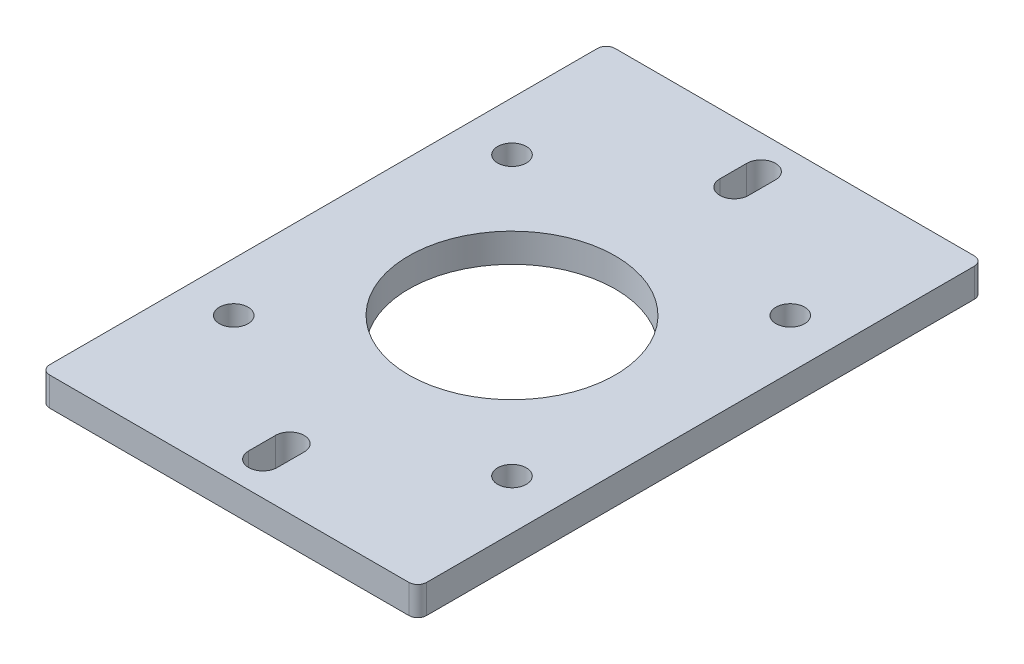
ISO-10303-21;
HEADER;
FILE_DESCRIPTION(('STEP AP214'),'2;1');
FILE_NAME('part.step','',(''),(''),'','','');
FILE_SCHEMA(('AUTOMOTIVE_DESIGN { 1 0 10303 214 1 1 1 1 }'));
ENDSEC;
DATA;
#1=APPLICATION_CONTEXT('core data for automotive mechanical design processes');
#2=APPLICATION_PROTOCOL_DEFINITION('international standard','automotive_design',2000,#1);
#3=PRODUCT_CONTEXT('',#1,'mechanical');
#4=PRODUCT('Part','Part','',(#3));
#5=PRODUCT_RELATED_PRODUCT_CATEGORY('part','',(#4));
#6=PRODUCT_DEFINITION_FORMATION('','',#4);
#7=PRODUCT_DEFINITION_CONTEXT('part definition',#1,'design');
#8=PRODUCT_DEFINITION('design','',#6,#7);
#9=PRODUCT_DEFINITION_SHAPE('','',#8);
#10=(LENGTH_UNIT() NAMED_UNIT(*) SI_UNIT(.MILLI.,.METRE.));
#11=(NAMED_UNIT(*) PLANE_ANGLE_UNIT() SI_UNIT($,.RADIAN.));
#12=(NAMED_UNIT(*) SI_UNIT($,.STERADIAN.) SOLID_ANGLE_UNIT());
#13=UNCERTAINTY_MEASURE_WITH_UNIT(LENGTH_MEASURE(1.E-05),#10,'distance_accuracy_value','');
#14=(GEOMETRIC_REPRESENTATION_CONTEXT(3) GLOBAL_UNCERTAINTY_ASSIGNED_CONTEXT((#13)) GLOBAL_UNIT_ASSIGNED_CONTEXT((#10,
#11,#12)) REPRESENTATION_CONTEXT('',''));
#15=CARTESIAN_POINT('',(0.,0.,0.));
#16=DIRECTION('',(0.,0.,1.));
#17=DIRECTION('',(1.,0.,0.));
#18=AXIS2_PLACEMENT_3D('',#15,#16,#17);
#19=CARTESIAN_POINT('',(0.,3.2,0.));
#20=DIRECTION('',(0.,1.,0.));
#21=DIRECTION('',(0.,0.,1.));
#22=AXIS2_PLACEMENT_3D('',#19,#20,#21);
#23=PLANE('',#22);
#24=DIRECTION('',(0.,0.,-1.));
#25=VECTOR('',#24,1.);
#26=CARTESIAN_POINT('',(1.60000000000005,3.2,-24.75));
#27=LINE('',#26,#25);
#28=CARTESIAN_POINT('',(1.59999999999998,3.2,-24.75));
#29=VERTEX_POINT('',#28);
#30=CARTESIAN_POINT('',(1.60000000000005,3.2,-27.75));
#31=VERTEX_POINT('',#30);
#32=EDGE_CURVE('E397',#29,#31,#27,.T.);
#33=ORIENTED_EDGE('',*,*,#32,.F.);
#34=CARTESIAN_POINT('',(0.,3.2,-24.75));
#35=DIRECTION('',(0.,1.,0.));
#36=DIRECTION('',(0.,0.,1.));
#37=AXIS2_PLACEMENT_3D('',#34,#35,#36);
#38=CIRCLE('',#37,1.59999999999999);
#39=CARTESIAN_POINT('',(-1.60000000000005,3.2,-24.75));
#40=VERTEX_POINT('',#39);
#41=EDGE_CURVE('E395',#40,#29,#38,.T.);
#42=ORIENTED_EDGE('',*,*,#41,.F.);
#43=DIRECTION('',(0.,0.,-1.));
#44=VECTOR('',#43,1.);
#45=CARTESIAN_POINT('',(-1.6,3.2,-24.75));
#46=LINE('',#45,#44);
#47=CARTESIAN_POINT('',(-1.6,3.2,-27.75));
#48=VERTEX_POINT('',#47);
#49=EDGE_CURVE('E377',#40,#48,#46,.T.);
#50=ORIENTED_EDGE('',*,*,#49,.T.);
#51=CARTESIAN_POINT('',(0.,3.2,-27.75));
#52=DIRECTION('',(0.,1.,0.));
#53=DIRECTION('',(0.,0.,1.));
#54=AXIS2_PLACEMENT_3D('',#51,#52,#53);
#55=CIRCLE('',#54,1.59999999999999);
#56=EDGE_CURVE('E384',#31,#48,#55,.T.);
#57=ORIENTED_EDGE('',*,*,#56,.F.);
#58=EDGE_LOOP('',(#33,#42,#50,#57));
#59=FACE_BOUND('',#58,.T.);
#60=DIRECTION('',(0.,0.,-1.));
#61=VECTOR('',#60,1.);
#62=CARTESIAN_POINT('',(1.60000000000005,3.2,27.75));
#63=LINE('',#62,#61);
#64=CARTESIAN_POINT('',(1.59999999999999,3.2,27.75));
#65=VERTEX_POINT('',#64);
#66=CARTESIAN_POINT('',(1.60000000000005,3.2,24.75));
#67=VERTEX_POINT('',#66);
#68=EDGE_CURVE('E383',#65,#67,#63,.T.);
#69=ORIENTED_EDGE('',*,*,#68,.F.);
#70=CARTESIAN_POINT('',(0.,3.2,27.75));
#71=DIRECTION('',(0.,1.,0.));
#72=DIRECTION('',(0.,0.,1.));
#73=AXIS2_PLACEMENT_3D('',#70,#71,#72);
#74=CIRCLE('',#73,1.59999999999999);
#75=CARTESIAN_POINT('',(-1.60000000000005,3.2,27.75));
#76=VERTEX_POINT('',#75);
#77=EDGE_CURVE('E414',#76,#65,#74,.T.);
#78=ORIENTED_EDGE('',*,*,#77,.F.);
#79=DIRECTION('',(0.,0.,-1.));
#80=VECTOR('',#79,1.);
#81=CARTESIAN_POINT('',(-1.59999999999999,3.2,27.75));
#82=LINE('',#81,#80);
#83=CARTESIAN_POINT('',(-1.59999999999999,3.2,24.75));
#84=VERTEX_POINT('',#83);
#85=EDGE_CURVE('E408',#76,#84,#82,.T.);
#86=ORIENTED_EDGE('',*,*,#85,.T.);
#87=CARTESIAN_POINT('',(0.,3.2,24.75));
#88=DIRECTION('',(0.,1.,0.));
#89=DIRECTION('',(0.,0.,1.));
#90=AXIS2_PLACEMENT_3D('',#87,#88,#89);
#91=CIRCLE('',#90,1.59999999999999);
#92=EDGE_CURVE('E421',#67,#84,#91,.T.);
#93=ORIENTED_EDGE('',*,*,#92,.F.);
#94=EDGE_LOOP('',(#69,#78,#86,#93));
#95=FACE_BOUND('',#94,.T.);
#96=CARTESIAN_POINT('',(-15.5,3.2,-15.5));
#97=DIRECTION('',(0.,1.,0.));
#98=DIRECTION('',(0.,0.,1.));
#99=AXIS2_PLACEMENT_3D('',#96,#97,#98);
#100=CIRCLE('',#99,1.6);
#101=CARTESIAN_POINT('',(-15.5,3.2,-13.9));
#102=VERTEX_POINT('',#101);
#103=EDGE_CURVE('E426',#102,#102,#100,.T.);
#104=ORIENTED_EDGE('',*,*,#103,.F.);
#105=EDGE_LOOP('',(#104));
#106=FACE_BOUND('',#105,.T.);
#107=CARTESIAN_POINT('',(15.5,3.2,-15.5));
#108=DIRECTION('',(0.,1.,0.));
#109=DIRECTION('',(0.,0.,1.));
#110=AXIS2_PLACEMENT_3D('',#107,#108,#109);
#111=CIRCLE('',#110,1.6);
#112=CARTESIAN_POINT('',(15.5,3.2,-13.9));
#113=VERTEX_POINT('',#112);
#114=EDGE_CURVE('E432',#113,#113,#111,.T.);
#115=ORIENTED_EDGE('',*,*,#114,.F.);
#116=EDGE_LOOP('',(#115));
#117=FACE_BOUND('',#116,.T.);
#118=CARTESIAN_POINT('',(15.5,3.2,15.5));
#119=DIRECTION('',(0.,1.,0.));
#120=DIRECTION('',(0.,0.,1.));
#121=AXIS2_PLACEMENT_3D('',#118,#119,#120);
#122=CIRCLE('',#121,1.6);
#123=CARTESIAN_POINT('',(15.5,3.2,17.1));
#124=VERTEX_POINT('',#123);
#125=EDGE_CURVE('E438',#124,#124,#122,.T.);
#126=ORIENTED_EDGE('',*,*,#125,.F.);
#127=EDGE_LOOP('',(#126));
#128=FACE_BOUND('',#127,.T.);
#129=CARTESIAN_POINT('',(-15.5,3.2,15.5));
#130=DIRECTION('',(0.,1.,0.));
#131=DIRECTION('',(0.,0.,1.));
#132=AXIS2_PLACEMENT_3D('',#129,#130,#131);
#133=CIRCLE('',#132,1.6);
#134=CARTESIAN_POINT('',(-15.5,3.2,17.1));
#135=VERTEX_POINT('',#134);
#136=EDGE_CURVE('E444',#135,#135,#133,.T.);
#137=ORIENTED_EDGE('',*,*,#136,.F.);
#138=EDGE_LOOP('',(#137));
#139=FACE_BOUND('',#138,.T.);
#140=DIRECTION('',(0.,0.,-1.));
#141=VECTOR('',#140,1.);
#142=CARTESIAN_POINT('',(21.,3.2,31.5));
#143=LINE('',#142,#141);
#144=CARTESIAN_POINT('',(21.,3.2,30.5));
#145=VERTEX_POINT('',#144);
#146=CARTESIAN_POINT('',(21.,3.2,-30.5));
#147=VERTEX_POINT('',#146);
#148=EDGE_CURVE('E462',#145,#147,#143,.T.);
#149=ORIENTED_EDGE('',*,*,#148,.T.);
#150=CARTESIAN_POINT('',(20.,3.2,-30.5));
#151=DIRECTION('',(0.,1.,0.));
#152=DIRECTION('',(0.,0.,1.));
#153=AXIS2_PLACEMENT_3D('',#150,#151,#152);
#154=CIRCLE('',#153,1.);
#155=CARTESIAN_POINT('',(20.,3.2,-31.5));
#156=VERTEX_POINT('',#155);
#157=EDGE_CURVE('E521',#147,#156,#154,.T.);
#158=ORIENTED_EDGE('',*,*,#157,.T.);
#159=DIRECTION('',(-1.,0.,0.));
#160=VECTOR('',#159,1.);
#161=CARTESIAN_POINT('',(21.,3.2,-31.5));
#162=LINE('',#161,#160);
#163=CARTESIAN_POINT('',(-20.,3.2,-31.5));
#164=VERTEX_POINT('',#163);
#165=EDGE_CURVE('E465',#156,#164,#162,.T.);
#166=ORIENTED_EDGE('',*,*,#165,.T.);
#167=CARTESIAN_POINT('',(-20.,3.2,-30.5));
#168=DIRECTION('',(0.,1.,0.));
#169=DIRECTION('',(0.,0.,1.));
#170=AXIS2_PLACEMENT_3D('',#167,#168,#169);
#171=CIRCLE('',#170,1.);
#172=CARTESIAN_POINT('',(-21.,3.2,-30.5));
#173=VERTEX_POINT('',#172);
#174=EDGE_CURVE('E516',#164,#173,#171,.T.);
#175=ORIENTED_EDGE('',*,*,#174,.T.);
#176=DIRECTION('',(0.,0.,1.));
#177=VECTOR('',#176,1.);
#178=CARTESIAN_POINT('',(-21.,3.2,31.5));
#179=LINE('',#178,#177);
#180=CARTESIAN_POINT('',(-21.,3.2,30.5));
#181=VERTEX_POINT('',#180);
#182=EDGE_CURVE('E457',#173,#181,#179,.T.);
#183=ORIENTED_EDGE('',*,*,#182,.T.);
#184=CARTESIAN_POINT('',(-20.,3.2,30.5));
#185=DIRECTION('',(0.,1.,0.));
#186=DIRECTION('',(0.,0.,1.));
#187=AXIS2_PLACEMENT_3D('',#184,#185,#186);
#188=CIRCLE('',#187,1.);
#189=CARTESIAN_POINT('',(-20.,3.2,31.5));
#190=VERTEX_POINT('',#189);
#191=EDGE_CURVE('E281',#181,#190,#188,.T.);
#192=ORIENTED_EDGE('',*,*,#191,.T.);
#193=DIRECTION('',(1.,0.,0.));
#194=VECTOR('',#193,1.);
#195=CARTESIAN_POINT('',(21.,3.2,31.5));
#196=LINE('',#195,#194);
#197=CARTESIAN_POINT('',(20.,3.2,31.5));
#198=VERTEX_POINT('',#197);
#199=EDGE_CURVE('E459',#190,#198,#196,.T.);
#200=ORIENTED_EDGE('',*,*,#199,.T.);
#201=CARTESIAN_POINT('',(20.,3.2,30.5));
#202=DIRECTION('',(0.,1.,0.));
#203=DIRECTION('',(0.,0.,1.));
#204=AXIS2_PLACEMENT_3D('',#201,#202,#203);
#205=CIRCLE('',#204,1.);
#206=EDGE_CURVE('E519',#198,#145,#205,.T.);
#207=ORIENTED_EDGE('',*,*,#206,.T.);
#208=EDGE_LOOP('',(#149,#158,#166,#175,#183,#192,#200,#207));
#209=FACE_BOUND('',#208,.T.);
#210=CARTESIAN_POINT('',(0.,3.2,0.));
#211=DIRECTION('',(0.,1.,0.));
#212=DIRECTION('',(0.,0.,1.));
#213=AXIS2_PLACEMENT_3D('',#210,#211,#212);
#214=CIRCLE('',#213,11.5);
#215=CARTESIAN_POINT('',(0.,3.2,11.5));
#216=VERTEX_POINT('',#215);
#217=EDGE_CURVE('E451',#216,#216,#214,.T.);
#218=ORIENTED_EDGE('',*,*,#217,.F.);
#219=EDGE_LOOP('',(#218));
#220=FACE_BOUND('',#219,.T.);
#221=ADVANCED_FACE('F259',(#59,#95,#106,#117,#128,#139,#209,#220),#23,.T.);
#222=CARTESIAN_POINT('',(0.,0.,0.));
#223=DIRECTION('',(0.,1.,0.));
#224=DIRECTION('',(0.,0.,1.));
#225=AXIS2_PLACEMENT_3D('',#222,#223,#224);
#226=PLANE('',#225);
#227=CARTESIAN_POINT('',(0.,0.,-27.75));
#228=DIRECTION('',(0.,1.,0.));
#229=DIRECTION('',(0.,0.,1.));
#230=AXIS2_PLACEMENT_3D('',#227,#228,#229);
#231=CIRCLE('',#230,1.59999999999999);
#232=CARTESIAN_POINT('',(1.59999999999999,0.,-27.75));
#233=VERTEX_POINT('',#232);
#234=CARTESIAN_POINT('',(-1.6,0.,-27.75));
#235=VERTEX_POINT('',#234);
#236=EDGE_CURVE('E495',#233,#235,#231,.T.);
#237=ORIENTED_EDGE('',*,*,#236,.T.);
#238=DIRECTION('',(0.,0.,1.));
#239=VECTOR('',#238,1.);
#240=CARTESIAN_POINT('',(-1.6,0.,0.));
#241=LINE('',#240,#239);
#242=CARTESIAN_POINT('',(-1.6,0.,-24.75));
#243=VERTEX_POINT('',#242);
#244=EDGE_CURVE('E380',#235,#243,#241,.T.);
#245=ORIENTED_EDGE('',*,*,#244,.T.);
#246=CARTESIAN_POINT('',(0.,0.,-24.75));
#247=DIRECTION('',(0.,1.,0.));
#248=DIRECTION('',(0.,0.,1.));
#249=AXIS2_PLACEMENT_3D('',#246,#247,#248);
#250=CIRCLE('',#249,1.59999999999999);
#251=CARTESIAN_POINT('',(1.59999999999999,0.,-24.75));
#252=VERTEX_POINT('',#251);
#253=EDGE_CURVE('E492',#243,#252,#250,.T.);
#254=ORIENTED_EDGE('',*,*,#253,.T.);
#255=DIRECTION('',(0.,0.,-1.));
#256=VECTOR('',#255,1.);
#257=CARTESIAN_POINT('',(1.59999999999999,0.,0.));
#258=LINE('',#257,#256);
#259=EDGE_CURVE('E489',#252,#233,#258,.T.);
#260=ORIENTED_EDGE('',*,*,#259,.T.);
#261=EDGE_LOOP('',(#237,#245,#254,#260));
#262=FACE_BOUND('',#261,.T.);
#263=CARTESIAN_POINT('',(0.,0.,24.75));
#264=DIRECTION('',(0.,1.,0.));
#265=DIRECTION('',(0.,0.,1.));
#266=AXIS2_PLACEMENT_3D('',#263,#264,#265);
#267=CIRCLE('',#266,1.59999999999999);
#268=CARTESIAN_POINT('',(1.6,0.,24.75));
#269=VERTEX_POINT('',#268);
#270=CARTESIAN_POINT('',(-1.59999999999999,0.,24.75));
#271=VERTEX_POINT('',#270);
#272=EDGE_CURVE('E483',#269,#271,#267,.T.);
#273=ORIENTED_EDGE('',*,*,#272,.T.);
#274=DIRECTION('',(0.,0.,1.));
#275=VECTOR('',#274,1.);
#276=CARTESIAN_POINT('',(-1.6,0.,0.));
#277=LINE('',#276,#275);
#278=CARTESIAN_POINT('',(-1.59999999999999,0.,27.75));
#279=VERTEX_POINT('',#278);
#280=EDGE_CURVE('E486',#271,#279,#277,.T.);
#281=ORIENTED_EDGE('',*,*,#280,.T.);
#282=CARTESIAN_POINT('',(0.,0.,27.75));
#283=DIRECTION('',(0.,1.,0.));
#284=DIRECTION('',(0.,0.,1.));
#285=AXIS2_PLACEMENT_3D('',#282,#283,#284);
#286=CIRCLE('',#285,1.59999999999999);
#287=CARTESIAN_POINT('',(1.6,0.,27.75));
#288=VERTEX_POINT('',#287);
#289=EDGE_CURVE('E480',#279,#288,#286,.T.);
#290=ORIENTED_EDGE('',*,*,#289,.T.);
#291=DIRECTION('',(0.,0.,-1.));
#292=VECTOR('',#291,1.);
#293=CARTESIAN_POINT('',(1.59999999999999,0.,0.));
#294=LINE('',#293,#292);
#295=EDGE_CURVE('E468',#288,#269,#294,.T.);
#296=ORIENTED_EDGE('',*,*,#295,.T.);
#297=EDGE_LOOP('',(#273,#281,#290,#296));
#298=FACE_BOUND('',#297,.T.);
#299=CARTESIAN_POINT('',(-15.5,0.,-15.5));
#300=DIRECTION('',(0.,1.,0.));
#301=DIRECTION('',(0.,0.,1.));
#302=AXIS2_PLACEMENT_3D('',#299,#300,#301);
#303=CIRCLE('',#302,1.6);
#304=CARTESIAN_POINT('',(-15.5,0.,-13.9));
#305=VERTEX_POINT('',#304);
#306=EDGE_CURVE('E429',#305,#305,#303,.T.);
#307=ORIENTED_EDGE('',*,*,#306,.T.);
#308=EDGE_LOOP('',(#307));
#309=FACE_BOUND('',#308,.T.);
#310=CARTESIAN_POINT('',(15.5,0.,-15.5));
#311=DIRECTION('',(0.,1.,0.));
#312=DIRECTION('',(0.,0.,1.));
#313=AXIS2_PLACEMENT_3D('',#310,#311,#312);
#314=CIRCLE('',#313,1.6);
#315=CARTESIAN_POINT('',(15.5,0.,-13.9));
#316=VERTEX_POINT('',#315);
#317=EDGE_CURVE('E435',#316,#316,#314,.T.);
#318=ORIENTED_EDGE('',*,*,#317,.T.);
#319=EDGE_LOOP('',(#318));
#320=FACE_BOUND('',#319,.T.);
#321=CARTESIAN_POINT('',(15.5,0.,15.5));
#322=DIRECTION('',(0.,1.,0.));
#323=DIRECTION('',(0.,0.,1.));
#324=AXIS2_PLACEMENT_3D('',#321,#322,#323);
#325=CIRCLE('',#324,1.6);
#326=CARTESIAN_POINT('',(15.5,0.,17.1));
#327=VERTEX_POINT('',#326);
#328=EDGE_CURVE('E441',#327,#327,#325,.T.);
#329=ORIENTED_EDGE('',*,*,#328,.T.);
#330=EDGE_LOOP('',(#329));
#331=FACE_BOUND('',#330,.T.);
#332=CARTESIAN_POINT('',(-15.5,0.,15.5));
#333=DIRECTION('',(0.,1.,0.));
#334=DIRECTION('',(0.,0.,1.));
#335=AXIS2_PLACEMENT_3D('',#332,#333,#334);
#336=CIRCLE('',#335,1.6);
#337=CARTESIAN_POINT('',(-15.5,0.,17.1));
#338=VERTEX_POINT('',#337);
#339=EDGE_CURVE('E447',#338,#338,#336,.T.);
#340=ORIENTED_EDGE('',*,*,#339,.T.);
#341=EDGE_LOOP('',(#340));
#342=FACE_BOUND('',#341,.T.);
#343=DIRECTION('',(-1.,0.,0.));
#344=VECTOR('',#343,1.);
#345=CARTESIAN_POINT('',(21.,0.,-31.5));
#346=LINE('',#345,#344);
#347=CARTESIAN_POINT('',(20.,0.,-31.5));
#348=VERTEX_POINT('',#347);
#349=CARTESIAN_POINT('',(-20.,0.,-31.5));
#350=VERTEX_POINT('',#349);
#351=EDGE_CURVE('E460',#348,#350,#346,.T.);
#352=ORIENTED_EDGE('',*,*,#351,.F.);
#353=CARTESIAN_POINT('',(20.,0.,-30.5));
#354=DIRECTION('',(0.,1.,0.));
#355=DIRECTION('',(0.,0.,1.));
#356=AXIS2_PLACEMENT_3D('',#353,#354,#355);
#357=CIRCLE('',#356,1.);
#358=CARTESIAN_POINT('',(21.,0.,-30.5));
#359=VERTEX_POINT('',#358);
#360=EDGE_CURVE('E509',#348,#359,#357,.F.);
#361=ORIENTED_EDGE('',*,*,#360,.T.);
#362=DIRECTION('',(0.,0.,-1.));
#363=VECTOR('',#362,1.);
#364=CARTESIAN_POINT('',(21.,0.,31.5));
#365=LINE('',#364,#363);
#366=CARTESIAN_POINT('',(21.,0.,30.5));
#367=VERTEX_POINT('',#366);
#368=EDGE_CURVE('E473',#367,#359,#365,.T.);
#369=ORIENTED_EDGE('',*,*,#368,.F.);
#370=CARTESIAN_POINT('',(20.,0.,30.5));
#371=DIRECTION('',(0.,1.,0.));
#372=DIRECTION('',(0.,0.,1.));
#373=AXIS2_PLACEMENT_3D('',#370,#371,#372);
#374=CIRCLE('',#373,1.);
#375=CARTESIAN_POINT('',(20.,0.,31.5));
#376=VERTEX_POINT('',#375);
#377=EDGE_CURVE('E507',#367,#376,#374,.F.);
#378=ORIENTED_EDGE('',*,*,#377,.T.);
#379=DIRECTION('',(1.,0.,0.));
#380=VECTOR('',#379,1.);
#381=CARTESIAN_POINT('',(21.,0.,31.5));
#382=LINE('',#381,#380);
#383=CARTESIAN_POINT('',(-20.,0.,31.5));
#384=VERTEX_POINT('',#383);
#385=EDGE_CURVE('E471',#384,#376,#382,.T.);
#386=ORIENTED_EDGE('',*,*,#385,.F.);
#387=CARTESIAN_POINT('',(-20.,0.,30.5));
#388=DIRECTION('',(0.,1.,0.));
#389=DIRECTION('',(0.,0.,1.));
#390=AXIS2_PLACEMENT_3D('',#387,#388,#389);
#391=CIRCLE('',#390,1.);
#392=CARTESIAN_POINT('',(-21.,0.,30.5));
#393=VERTEX_POINT('',#392);
#394=EDGE_CURVE('E505',#384,#393,#391,.F.);
#395=ORIENTED_EDGE('',*,*,#394,.T.);
#396=DIRECTION('',(0.,0.,1.));
#397=VECTOR('',#396,1.);
#398=CARTESIAN_POINT('',(-21.,0.,31.5));
#399=LINE('',#398,#397);
#400=CARTESIAN_POINT('',(-21.,0.,-30.5));
#401=VERTEX_POINT('',#400);
#402=EDGE_CURVE('E454',#401,#393,#399,.T.);
#403=ORIENTED_EDGE('',*,*,#402,.F.);
#404=CARTESIAN_POINT('',(-20.,0.,-30.5));
#405=DIRECTION('',(0.,1.,0.));
#406=DIRECTION('',(0.,0.,1.));
#407=AXIS2_PLACEMENT_3D('',#404,#405,#406);
#408=CIRCLE('',#407,1.);
#409=EDGE_CURVE('E503',#401,#350,#408,.F.);
#410=ORIENTED_EDGE('',*,*,#409,.T.);
#411=EDGE_LOOP('',(#352,#361,#369,#378,#386,#395,#403,#410));
#412=FACE_BOUND('',#411,.T.);
#413=CARTESIAN_POINT('',(0.,0.,0.));
#414=DIRECTION('',(0.,1.,0.));
#415=DIRECTION('',(0.,0.,1.));
#416=AXIS2_PLACEMENT_3D('',#413,#414,#415);
#417=CIRCLE('',#416,11.5);
#418=CARTESIAN_POINT('',(0.,0.,11.5));
#419=VERTEX_POINT('',#418);
#420=EDGE_CURVE('E450',#419,#419,#417,.T.);
#421=ORIENTED_EDGE('',*,*,#420,.T.);
#422=EDGE_LOOP('',(#421));
#423=FACE_BOUND('',#422,.T.);
#424=ADVANCED_FACE('F537',(#262,#298,#309,#320,#331,#342,#412,#423),#226,.F.);
#425=CARTESIAN_POINT('',(-21.,3.2,31.5));
#426=DIRECTION('',(1.,0.,0.));
#427=DIRECTION('',(0.,0.,-1.));
#428=AXIS2_PLACEMENT_3D('',#425,#426,#427);
#429=PLANE('',#428);
#430=ORIENTED_EDGE('',*,*,#402,.T.);
#431=DIRECTION('',(0.,-1.,0.));
#432=VECTOR('',#431,1.);
#433=CARTESIAN_POINT('',(-21.,3.2,30.5));
#434=LINE('',#433,#432);
#435=EDGE_CURVE('E13',#393,#181,#434,.F.);
#436=ORIENTED_EDGE('',*,*,#435,.T.);
#437=ORIENTED_EDGE('',*,*,#182,.F.);
#438=DIRECTION('',(0.,-1.,0.));
#439=VECTOR('',#438,1.);
#440=CARTESIAN_POINT('',(-21.,3.2,-30.5));
#441=LINE('',#440,#439);
#442=EDGE_CURVE('E267',#173,#401,#441,.T.);
#443=ORIENTED_EDGE('',*,*,#442,.T.);
#444=EDGE_LOOP('',(#430,#436,#437,#443));
#445=FACE_BOUND('',#444,.T.);
#446=ADVANCED_FACE('F531',(#445),#429,.F.);
#447=CARTESIAN_POINT('',(21.,3.2,31.5));
#448=DIRECTION('',(0.,0.,-1.));
#449=DIRECTION('',(-1.,0.,0.));
#450=AXIS2_PLACEMENT_3D('',#447,#448,#449);
#451=PLANE('',#450);
#452=ORIENTED_EDGE('',*,*,#385,.T.);
#453=DIRECTION('',(0.,-1.,0.));
#454=VECTOR('',#453,1.);
#455=CARTESIAN_POINT('',(20.,3.2,31.5));
#456=LINE('',#455,#454);
#457=EDGE_CURVE('E274',#376,#198,#456,.F.);
#458=ORIENTED_EDGE('',*,*,#457,.T.);
#459=ORIENTED_EDGE('',*,*,#199,.F.);
#460=DIRECTION('',(0.,-1.,0.));
#461=VECTOR('',#460,1.);
#462=CARTESIAN_POINT('',(-20.,3.2,31.5));
#463=LINE('',#462,#461);
#464=EDGE_CURVE('E523',#190,#384,#463,.T.);
#465=ORIENTED_EDGE('',*,*,#464,.T.);
#466=EDGE_LOOP('',(#452,#458,#459,#465));
#467=FACE_BOUND('',#466,.T.);
#468=ADVANCED_FACE('F543',(#467),#451,.F.);
#469=CARTESIAN_POINT('',(21.,3.2,31.5));
#470=DIRECTION('',(-1.,0.,0.));
#471=DIRECTION('',(0.,0.,1.));
#472=AXIS2_PLACEMENT_3D('',#469,#470,#471);
#473=PLANE('',#472);
#474=ORIENTED_EDGE('',*,*,#368,.T.);
#475=DIRECTION('',(0.,-1.,0.));
#476=VECTOR('',#475,1.);
#477=CARTESIAN_POINT('',(21.,3.2,-30.5));
#478=LINE('',#477,#476);
#479=EDGE_CURVE('E514',#359,#147,#478,.F.);
#480=ORIENTED_EDGE('',*,*,#479,.T.);
#481=ORIENTED_EDGE('',*,*,#148,.F.);
#482=DIRECTION('',(0.,-1.,0.));
#483=VECTOR('',#482,1.);
#484=CARTESIAN_POINT('',(21.,3.2,30.5));
#485=LINE('',#484,#483);
#486=EDGE_CURVE('E511',#145,#367,#485,.T.);
#487=ORIENTED_EDGE('',*,*,#486,.T.);
#488=EDGE_LOOP('',(#474,#480,#481,#487));
#489=FACE_BOUND('',#488,.T.);
#490=ADVANCED_FACE('F552',(#489),#473,.F.);
#491=CARTESIAN_POINT('',(21.,3.2,-31.5));
#492=DIRECTION('',(0.,0.,1.));
#493=DIRECTION('',(1.,0.,0.));
#494=AXIS2_PLACEMENT_3D('',#491,#492,#493);
#495=PLANE('',#494);
#496=ORIENTED_EDGE('',*,*,#165,.F.);
#497=DIRECTION('',(0.,-1.,0.));
#498=VECTOR('',#497,1.);
#499=CARTESIAN_POINT('',(20.,3.2,-31.5));
#500=LINE('',#499,#498);
#501=EDGE_CURVE('E500',#156,#348,#500,.T.);
#502=ORIENTED_EDGE('',*,*,#501,.T.);
#503=ORIENTED_EDGE('',*,*,#351,.T.);
#504=DIRECTION('',(0.,-1.,0.));
#505=VECTOR('',#504,1.);
#506=CARTESIAN_POINT('',(-20.,3.2,-31.5));
#507=LINE('',#506,#505);
#508=EDGE_CURVE('E498',#350,#164,#507,.F.);
#509=ORIENTED_EDGE('',*,*,#508,.T.);
#510=EDGE_LOOP('',(#496,#502,#503,#509));
#511=FACE_BOUND('',#510,.T.);
#512=ADVANCED_FACE('F560',(#511),#495,.F.);
#513=CARTESIAN_POINT('',(0.,3.2,0.));
#514=DIRECTION('',(0.,-1.,0.));
#515=DIRECTION('',(0.,0.,-1.));
#516=AXIS2_PLACEMENT_3D('',#513,#514,#515);
#517=CYLINDRICAL_SURFACE('',#516,11.5);
#518=ORIENTED_EDGE('',*,*,#217,.T.);
#519=EDGE_LOOP('',(#518));
#520=FACE_BOUND('',#519,.T.);
#521=ORIENTED_EDGE('',*,*,#420,.F.);
#522=EDGE_LOOP('',(#521));
#523=FACE_BOUND('',#522,.T.);
#524=ADVANCED_FACE('F574',(#520,#523),#517,.F.);
#525=CARTESIAN_POINT('',(-15.5,3.2,15.5));
#526=DIRECTION('',(0.,1.,0.));
#527=DIRECTION('',(0.,0.,1.));
#528=AXIS2_PLACEMENT_3D('',#525,#526,#527);
#529=CYLINDRICAL_SURFACE('',#528,1.6);
#530=ORIENTED_EDGE('',*,*,#339,.F.);
#531=EDGE_LOOP('',(#530));
#532=FACE_BOUND('',#531,.T.);
#533=ORIENTED_EDGE('',*,*,#136,.T.);
#534=EDGE_LOOP('',(#533));
#535=FACE_BOUND('',#534,.T.);
#536=ADVANCED_FACE('F719',(#532,#535),#529,.F.);
#537=CARTESIAN_POINT('',(15.5,3.2,15.5));
#538=DIRECTION('',(0.,1.,0.));
#539=DIRECTION('',(0.,0.,1.));
#540=AXIS2_PLACEMENT_3D('',#537,#538,#539);
#541=CYLINDRICAL_SURFACE('',#540,1.6);
#542=ORIENTED_EDGE('',*,*,#328,.F.);
#543=EDGE_LOOP('',(#542));
#544=FACE_BOUND('',#543,.T.);
#545=ORIENTED_EDGE('',*,*,#125,.T.);
#546=EDGE_LOOP('',(#545));
#547=FACE_BOUND('',#546,.T.);
#548=ADVANCED_FACE('F709',(#544,#547),#541,.F.);
#549=CARTESIAN_POINT('',(15.5,3.2,-15.5));
#550=DIRECTION('',(0.,1.,0.));
#551=DIRECTION('',(0.,0.,1.));
#552=AXIS2_PLACEMENT_3D('',#549,#550,#551);
#553=CYLINDRICAL_SURFACE('',#552,1.6);
#554=ORIENTED_EDGE('',*,*,#317,.F.);
#555=EDGE_LOOP('',(#554));
#556=FACE_BOUND('',#555,.T.);
#557=ORIENTED_EDGE('',*,*,#114,.T.);
#558=EDGE_LOOP('',(#557));
#559=FACE_BOUND('',#558,.T.);
#560=ADVANCED_FACE('F699',(#556,#559),#553,.F.);
#561=CARTESIAN_POINT('',(-15.5,3.2,-15.5));
#562=DIRECTION('',(0.,1.,0.));
#563=DIRECTION('',(0.,0.,1.));
#564=AXIS2_PLACEMENT_3D('',#561,#562,#563);
#565=CYLINDRICAL_SURFACE('',#564,1.6);
#566=ORIENTED_EDGE('',*,*,#306,.F.);
#567=EDGE_LOOP('',(#566));
#568=FACE_BOUND('',#567,.T.);
#569=ORIENTED_EDGE('',*,*,#103,.T.);
#570=EDGE_LOOP('',(#569));
#571=FACE_BOUND('',#570,.T.);
#572=ADVANCED_FACE('F689',(#568,#571),#565,.F.);
#573=CARTESIAN_POINT('',(0.,3.2,24.75));
#574=DIRECTION('',(0.,1.,0.));
#575=DIRECTION('',(0.,0.,1.));
#576=AXIS2_PLACEMENT_3D('',#573,#574,#575);
#577=CYLINDRICAL_SURFACE('',#576,1.59999999999999);
#578=DIRECTION('',(0.,-1.,0.));
#579=VECTOR('',#578,1.);
#580=CARTESIAN_POINT('',(1.6,-0.00100000000000013,24.75));
#581=LINE('',#580,#579);
#582=EDGE_CURVE('E419',#67,#269,#581,.T.);
#583=ORIENTED_EDGE('',*,*,#582,.F.);
#584=ORIENTED_EDGE('',*,*,#92,.T.);
#585=DIRECTION('',(0.,1.,0.));
#586=VECTOR('',#585,1.);
#587=CARTESIAN_POINT('',(-1.59999999999999,3.2,24.75));
#588=LINE('',#587,#586);
#589=EDGE_CURVE('E424',#271,#84,#588,.T.);
#590=ORIENTED_EDGE('',*,*,#589,.F.);
#591=ORIENTED_EDGE('',*,*,#272,.F.);
#592=EDGE_LOOP('',(#583,#584,#590,#591));
#593=FACE_BOUND('',#592,.T.);
#594=ADVANCED_FACE('F679',(#593),#577,.F.);
#595=CARTESIAN_POINT('',(0.,3.2,27.75));
#596=DIRECTION('',(0.,1.,0.));
#597=DIRECTION('',(0.,0.,1.));
#598=AXIS2_PLACEMENT_3D('',#595,#596,#597);
#599=CYLINDRICAL_SURFACE('',#598,1.59999999999999);
#600=DIRECTION('',(0.,1.,0.));
#601=VECTOR('',#600,1.);
#602=CARTESIAN_POINT('',(-1.59999999999999,3.2,27.75));
#603=LINE('',#602,#601);
#604=EDGE_CURVE('E416',#76,#279,#603,.F.);
#605=ORIENTED_EDGE('',*,*,#604,.F.);
#606=ORIENTED_EDGE('',*,*,#77,.T.);
#607=DIRECTION('',(0.,-1.,0.));
#608=VECTOR('',#607,1.);
#609=CARTESIAN_POINT('',(1.6,-0.00100000000000013,27.75));
#610=LINE('',#609,#608);
#611=EDGE_CURVE('E411',#65,#288,#610,.T.);
#612=ORIENTED_EDGE('',*,*,#611,.T.);
#613=ORIENTED_EDGE('',*,*,#289,.F.);
#614=EDGE_LOOP('',(#605,#606,#612,#613));
#615=FACE_BOUND('',#614,.T.);
#616=ADVANCED_FACE('F669',(#615),#599,.F.);
#617=CARTESIAN_POINT('',(-1.59999999999999,3.2,27.75));
#618=DIRECTION('',(-1.,0.,0.));
#619=DIRECTION('',(0.,0.,1.));
#620=AXIS2_PLACEMENT_3D('',#617,#618,#619);
#621=PLANE('',#620);
#622=ORIENTED_EDGE('',*,*,#589,.T.);
#623=ORIENTED_EDGE('',*,*,#85,.F.);
#624=ORIENTED_EDGE('',*,*,#604,.T.);
#625=ORIENTED_EDGE('',*,*,#280,.F.);
#626=EDGE_LOOP('',(#622,#623,#624,#625));
#627=FACE_BOUND('',#626,.T.);
#628=ADVANCED_FACE('F659',(#627),#621,.F.);
#629=CARTESIAN_POINT('',(1.6,-0.00100000000000013,27.75));
#630=DIRECTION('',(1.,0.,0.));
#631=DIRECTION('',(0.,1.,0.));
#632=AXIS2_PLACEMENT_3D('',#629,#630,#631);
#633=PLANE('',#632);
#634=ORIENTED_EDGE('',*,*,#611,.F.);
#635=ORIENTED_EDGE('',*,*,#68,.T.);
#636=ORIENTED_EDGE('',*,*,#582,.T.);
#637=ORIENTED_EDGE('',*,*,#295,.F.);
#638=EDGE_LOOP('',(#634,#635,#636,#637));
#639=FACE_BOUND('',#638,.T.);
#640=ADVANCED_FACE('F650',(#639),#633,.F.);
#641=CARTESIAN_POINT('',(0.,3.2,-27.75));
#642=DIRECTION('',(0.,1.,0.));
#643=DIRECTION('',(0.,0.,1.));
#644=AXIS2_PLACEMENT_3D('',#641,#642,#643);
#645=CYLINDRICAL_SURFACE('',#644,1.59999999999999);
#646=DIRECTION('',(0.,-1.,0.));
#647=VECTOR('',#646,1.);
#648=CARTESIAN_POINT('',(1.59999999999999,-0.00100000000000013,-27.75));
#649=LINE('',#648,#647);
#650=EDGE_CURVE('E390',#31,#233,#649,.T.);
#651=ORIENTED_EDGE('',*,*,#650,.F.);
#652=ORIENTED_EDGE('',*,*,#56,.T.);
#653=DIRECTION('',(0.,1.,0.));
#654=VECTOR('',#653,1.);
#655=CARTESIAN_POINT('',(-1.6,3.2,-27.75));
#656=LINE('',#655,#654);
#657=EDGE_CURVE('E373',#235,#48,#656,.T.);
#658=ORIENTED_EDGE('',*,*,#657,.F.);
#659=ORIENTED_EDGE('',*,*,#236,.F.);
#660=EDGE_LOOP('',(#651,#652,#658,#659));
#661=FACE_BOUND('',#660,.T.);
#662=ADVANCED_FACE('F388',(#661),#645,.F.);
#663=CARTESIAN_POINT('',(0.,3.2,-24.75));
#664=DIRECTION('',(0.,1.,0.));
#665=DIRECTION('',(0.,0.,1.));
#666=AXIS2_PLACEMENT_3D('',#663,#664,#665);
#667=CYLINDRICAL_SURFACE('',#666,1.59999999999999);
#668=DIRECTION('',(0.,1.,0.));
#669=VECTOR('',#668,1.);
#670=CARTESIAN_POINT('',(-1.6,3.2,-24.75));
#671=LINE('',#670,#669);
#672=EDGE_CURVE('E404',#40,#243,#671,.F.);
#673=ORIENTED_EDGE('',*,*,#672,.F.);
#674=ORIENTED_EDGE('',*,*,#41,.T.);
#675=DIRECTION('',(0.,-1.,0.));
#676=VECTOR('',#675,1.);
#677=CARTESIAN_POINT('',(1.59999999999999,-0.00100000000000013,-24.75));
#678=LINE('',#677,#676);
#679=EDGE_CURVE('E396',#29,#252,#678,.T.);
#680=ORIENTED_EDGE('',*,*,#679,.T.);
#681=ORIENTED_EDGE('',*,*,#253,.F.);
#682=EDGE_LOOP('',(#673,#674,#680,#681));
#683=FACE_BOUND('',#682,.T.);
#684=ADVANCED_FACE('F632',(#683),#667,.F.);
#685=CARTESIAN_POINT('',(-1.6,3.2,-24.75));
#686=DIRECTION('',(-1.,0.,0.));
#687=DIRECTION('',(0.,0.,1.));
#688=AXIS2_PLACEMENT_3D('',#685,#686,#687);
#689=PLANE('',#688);
#690=ORIENTED_EDGE('',*,*,#657,.T.);
#691=ORIENTED_EDGE('',*,*,#49,.F.);
#692=ORIENTED_EDGE('',*,*,#672,.T.);
#693=ORIENTED_EDGE('',*,*,#244,.F.);
#694=EDGE_LOOP('',(#690,#691,#692,#693));
#695=FACE_BOUND('',#694,.T.);
#696=ADVANCED_FACE('F375',(#695),#689,.F.);
#697=CARTESIAN_POINT('',(1.59999999999999,-0.00100000000000013,-24.75));
#698=DIRECTION('',(1.,0.,0.));
#699=DIRECTION('',(0.,1.,0.));
#700=AXIS2_PLACEMENT_3D('',#697,#698,#699);
#701=PLANE('',#700);
#702=ORIENTED_EDGE('',*,*,#679,.F.);
#703=ORIENTED_EDGE('',*,*,#32,.T.);
#704=ORIENTED_EDGE('',*,*,#650,.T.);
#705=ORIENTED_EDGE('',*,*,#259,.F.);
#706=EDGE_LOOP('',(#702,#703,#704,#705));
#707=FACE_BOUND('',#706,.T.);
#708=ADVANCED_FACE('F587',(#707),#701,.F.);
#709=CARTESIAN_POINT('',(20.,3.2,-30.5));
#710=DIRECTION('',(0.,-1.,0.));
#711=DIRECTION('',(0.,0.,-1.));
#712=AXIS2_PLACEMENT_3D('',#709,#710,#711);
#713=CYLINDRICAL_SURFACE('',#712,1.);
#714=ORIENTED_EDGE('',*,*,#157,.F.);
#715=ORIENTED_EDGE('',*,*,#479,.F.);
#716=ORIENTED_EDGE('',*,*,#360,.F.);
#717=ORIENTED_EDGE('',*,*,#501,.F.);
#718=EDGE_LOOP('',(#714,#715,#716,#717));
#719=FACE_BOUND('',#718,.T.);
#720=ADVANCED_FACE('F557',(#719),#713,.T.);
#721=CARTESIAN_POINT('',(20.,3.2,30.5));
#722=DIRECTION('',(0.,-1.,0.));
#723=DIRECTION('',(0.,0.,-1.));
#724=AXIS2_PLACEMENT_3D('',#721,#722,#723);
#725=CYLINDRICAL_SURFACE('',#724,1.);
#726=ORIENTED_EDGE('',*,*,#206,.F.);
#727=ORIENTED_EDGE('',*,*,#457,.F.);
#728=ORIENTED_EDGE('',*,*,#377,.F.);
#729=ORIENTED_EDGE('',*,*,#486,.F.);
#730=EDGE_LOOP('',(#726,#727,#728,#729));
#731=FACE_BOUND('',#730,.T.);
#732=ADVANCED_FACE('F549',(#731),#725,.T.);
#733=CARTESIAN_POINT('',(-20.,3.2,30.5));
#734=DIRECTION('',(0.,-1.,0.));
#735=DIRECTION('',(0.,0.,-1.));
#736=AXIS2_PLACEMENT_3D('',#733,#734,#735);
#737=CYLINDRICAL_SURFACE('',#736,1.);
#738=ORIENTED_EDGE('',*,*,#191,.F.);
#739=ORIENTED_EDGE('',*,*,#435,.F.);
#740=ORIENTED_EDGE('',*,*,#394,.F.);
#741=ORIENTED_EDGE('',*,*,#464,.F.);
#742=EDGE_LOOP('',(#738,#739,#740,#741));
#743=FACE_BOUND('',#742,.T.);
#744=ADVANCED_FACE('F542',(#743),#737,.T.);
#745=CARTESIAN_POINT('',(-20.,3.2,-30.5));
#746=DIRECTION('',(0.,-1.,0.));
#747=DIRECTION('',(0.,0.,-1.));
#748=AXIS2_PLACEMENT_3D('',#745,#746,#747);
#749=CYLINDRICAL_SURFACE('',#748,1.);
#750=ORIENTED_EDGE('',*,*,#174,.F.);
#751=ORIENTED_EDGE('',*,*,#508,.F.);
#752=ORIENTED_EDGE('',*,*,#409,.F.);
#753=ORIENTED_EDGE('',*,*,#442,.F.);
#754=EDGE_LOOP('',(#750,#751,#752,#753));
#755=FACE_BOUND('',#754,.T.);
#756=ADVANCED_FACE('F261',(#755),#749,.T.);
#757=CLOSED_SHELL('',(#221,#424,#446,#468,#490,#512,#524,#536,#548,#560,#572,#594,#616,#628,
#640,#662,#684,#696,#708,#720,#732,#744,#756));
#758=MANIFOLD_SOLID_BREP('B2',#757);
#759=ADVANCED_BREP_SHAPE_REPRESENTATION('',(#18,#758),#14);
#760=SHAPE_DEFINITION_REPRESENTATION(#9,#759);
ENDSEC;
END-ISO-10303-21;
